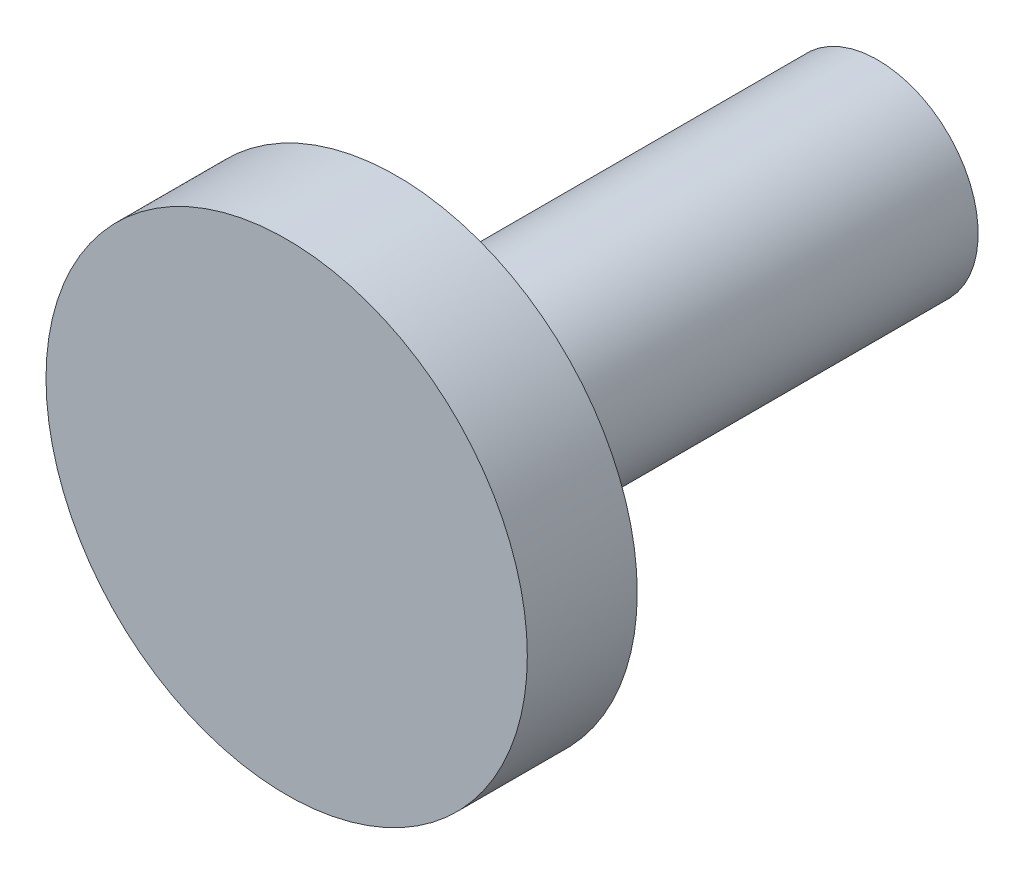
ISO-10303-21;
HEADER;
FILE_DESCRIPTION(('STEP AP214'),'2;1');
FILE_NAME('part.step','',(''),(''),'','','');
FILE_SCHEMA(('AUTOMOTIVE_DESIGN { 1 0 10303 214 1 1 1 1 }'));
ENDSEC;
DATA;
#1=APPLICATION_CONTEXT('core data for automotive mechanical design processes');
#2=APPLICATION_PROTOCOL_DEFINITION('international standard','automotive_design',2000,#1);
#3=PRODUCT_CONTEXT('',#1,'mechanical');
#4=PRODUCT('Part','Part','',(#3));
#5=PRODUCT_RELATED_PRODUCT_CATEGORY('part','',(#4));
#6=PRODUCT_DEFINITION_FORMATION('','',#4);
#7=PRODUCT_DEFINITION_CONTEXT('part definition',#1,'design');
#8=PRODUCT_DEFINITION('design','',#6,#7);
#9=PRODUCT_DEFINITION_SHAPE('','',#8);
#10=(LENGTH_UNIT() NAMED_UNIT(*) SI_UNIT(.MILLI.,.METRE.));
#11=(NAMED_UNIT(*) PLANE_ANGLE_UNIT() SI_UNIT($,.RADIAN.));
#12=(NAMED_UNIT(*) SI_UNIT($,.STERADIAN.) SOLID_ANGLE_UNIT());
#13=UNCERTAINTY_MEASURE_WITH_UNIT(LENGTH_MEASURE(1.E-05),#10,'distance_accuracy_value','');
#14=(GEOMETRIC_REPRESENTATION_CONTEXT(3) GLOBAL_UNCERTAINTY_ASSIGNED_CONTEXT((#13)) GLOBAL_UNIT_ASSIGNED_CONTEXT((#10,
#11,#12)) REPRESENTATION_CONTEXT('',''));
#15=CARTESIAN_POINT('',(0.,0.,0.));
#16=DIRECTION('',(0.,0.,1.));
#17=DIRECTION('',(1.,0.,0.));
#18=AXIS2_PLACEMENT_3D('',#15,#16,#17);
#19=CARTESIAN_POINT('',(0.,0.,1.37));
#20=DIRECTION('',(0.,0.,-1.));
#21=DIRECTION('',(-1.,0.,0.));
#22=AXIS2_PLACEMENT_3D('',#19,#20,#21);
#23=CYLINDRICAL_SURFACE('',#22,3.);
#24=CARTESIAN_POINT('',(0.,0.,1.37));
#25=DIRECTION('',(0.,0.,1.));
#26=DIRECTION('',(1.,0.,0.));
#27=AXIS2_PLACEMENT_3D('',#24,#25,#26);
#28=CIRCLE('',#27,3.);
#29=CARTESIAN_POINT('',(3.,0.,1.37));
#30=VERTEX_POINT('',#29);
#31=EDGE_CURVE('E38',#30,#30,#28,.T.);
#32=ORIENTED_EDGE('',*,*,#31,.F.);
#33=EDGE_LOOP('',(#32));
#34=FACE_BOUND('',#33,.T.);
#35=CARTESIAN_POINT('',(0.,0.,0.));
#36=DIRECTION('',(0.,0.,1.));
#37=DIRECTION('',(1.,0.,0.));
#38=AXIS2_PLACEMENT_3D('',#35,#36,#37);
#39=CIRCLE('',#38,3.);
#40=CARTESIAN_POINT('',(3.,0.,0.));
#41=VERTEX_POINT('',#40);
#42=EDGE_CURVE('E34',#41,#41,#39,.T.);
#43=ORIENTED_EDGE('',*,*,#42,.T.);
#44=EDGE_LOOP('',(#43));
#45=FACE_BOUND('',#44,.T.);
#46=ADVANCED_FACE('F31',(#34,#45),#23,.T.);
#47=CARTESIAN_POINT('',(0.,0.,1.37));
#48=DIRECTION('',(0.,0.,1.));
#49=DIRECTION('',(1.,0.,0.));
#50=AXIS2_PLACEMENT_3D('',#47,#48,#49);
#51=PLANE('',#50);
#52=ORIENTED_EDGE('',*,*,#31,.T.);
#53=EDGE_LOOP('',(#52));
#54=FACE_BOUND('',#53,.T.);
#55=ADVANCED_FACE('F55',(#54),#51,.T.);
#56=CARTESIAN_POINT('',(0.,0.,0.));
#57=DIRECTION('',(0.,0.,1.));
#58=DIRECTION('',(1.,0.,0.));
#59=AXIS2_PLACEMENT_3D('',#56,#57,#58);
#60=PLANE('',#59);
#61=CARTESIAN_POINT('',(0.,0.,0.));
#62=DIRECTION('',(0.,0.,-1.));
#63=DIRECTION('',(-1.,0.,0.));
#64=AXIS2_PLACEMENT_3D('',#61,#62,#63);
#65=CIRCLE('',#64,1.25);
#66=CARTESIAN_POINT('',(-1.25,0.,0.));
#67=VERTEX_POINT('',#66);
#68=EDGE_CURVE('E10',#67,#67,#65,.T.);
#69=ORIENTED_EDGE('',*,*,#68,.F.);
#70=EDGE_LOOP('',(#69));
#71=FACE_BOUND('',#70,.T.);
#72=ORIENTED_EDGE('',*,*,#42,.F.);
#73=EDGE_LOOP('',(#72));
#74=FACE_BOUND('',#73,.T.);
#75=ADVANCED_FACE('F52',(#71,#74),#60,.F.);
#76=CARTESIAN_POINT('',(0.,0.,-6.));
#77=DIRECTION('',(0.,0.,1.));
#78=DIRECTION('',(1.,0.,0.));
#79=AXIS2_PLACEMENT_3D('',#76,#77,#78);
#80=CYLINDRICAL_SURFACE('',#79,1.25);
#81=CARTESIAN_POINT('',(0.,0.,-6.));
#82=DIRECTION('',(0.,0.,-1.));
#83=DIRECTION('',(-1.,0.,0.));
#84=AXIS2_PLACEMENT_3D('',#81,#82,#83);
#85=CIRCLE('',#84,1.25);
#86=CARTESIAN_POINT('',(-1.25,0.,-6.));
#87=VERTEX_POINT('',#86);
#88=EDGE_CURVE('E44',#87,#87,#85,.T.);
#89=ORIENTED_EDGE('',*,*,#88,.F.);
#90=EDGE_LOOP('',(#89));
#91=FACE_BOUND('',#90,.T.);
#92=ORIENTED_EDGE('',*,*,#68,.T.);
#93=EDGE_LOOP('',(#92));
#94=FACE_BOUND('',#93,.T.);
#95=ADVANCED_FACE('F54',(#91,#94),#80,.T.);
#96=CARTESIAN_POINT('',(0.,0.,-6.));
#97=DIRECTION('',(0.,0.,-1.));
#98=DIRECTION('',(-1.,0.,0.));
#99=AXIS2_PLACEMENT_3D('',#96,#97,#98);
#100=PLANE('',#99);
#101=ORIENTED_EDGE('',*,*,#88,.T.);
#102=EDGE_LOOP('',(#101));
#103=FACE_BOUND('',#102,.T.);
#104=ADVANCED_FACE('F61',(#103),#100,.T.);
#105=CLOSED_SHELL('',(#46,#55,#75,#95,#104));
#106=MANIFOLD_SOLID_BREP('B2',#105);
#107=ADVANCED_BREP_SHAPE_REPRESENTATION('',(#18,#106),#14);
#108=SHAPE_DEFINITION_REPRESENTATION(#9,#107);
ENDSEC;
END-ISO-10303-21;
